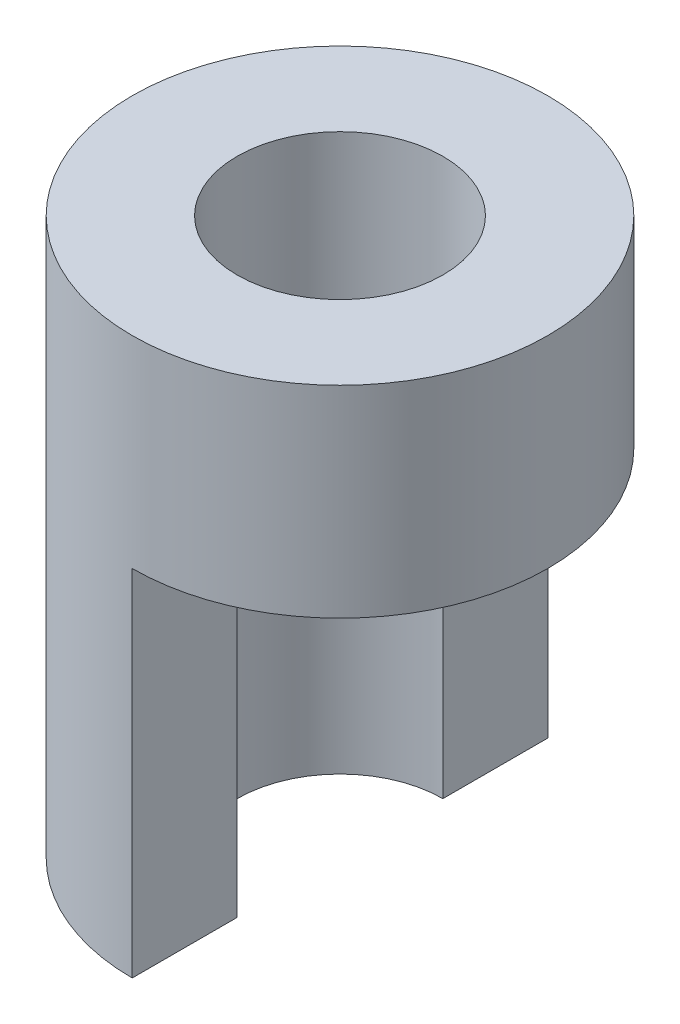
ISO-10303-21;
HEADER;
FILE_DESCRIPTION(('STEP AP214'),'2;1');
FILE_NAME('part.step','',(''),(''),'','','');
FILE_SCHEMA(('AUTOMOTIVE_DESIGN { 1 0 10303 214 1 1 1 1 }'));
ENDSEC;
DATA;
#1=APPLICATION_CONTEXT('core data for automotive mechanical design processes');
#2=APPLICATION_PROTOCOL_DEFINITION('international standard','automotive_design',2000,#1);
#3=PRODUCT_CONTEXT('',#1,'mechanical');
#4=PRODUCT('Part','Part','',(#3));
#5=PRODUCT_RELATED_PRODUCT_CATEGORY('part','',(#4));
#6=PRODUCT_DEFINITION_FORMATION('','',#4);
#7=PRODUCT_DEFINITION_CONTEXT('part definition',#1,'design');
#8=PRODUCT_DEFINITION('design','',#6,#7);
#9=PRODUCT_DEFINITION_SHAPE('','',#8);
#10=(LENGTH_UNIT() NAMED_UNIT(*) SI_UNIT(.MILLI.,.METRE.));
#11=(NAMED_UNIT(*) PLANE_ANGLE_UNIT() SI_UNIT($,.RADIAN.));
#12=(NAMED_UNIT(*) SI_UNIT($,.STERADIAN.) SOLID_ANGLE_UNIT());
#13=UNCERTAINTY_MEASURE_WITH_UNIT(LENGTH_MEASURE(1.E-05),#10,'distance_accuracy_value','');
#14=(GEOMETRIC_REPRESENTATION_CONTEXT(3) GLOBAL_UNCERTAINTY_ASSIGNED_CONTEXT((#13)) GLOBAL_UNIT_ASSIGNED_CONTEXT((#10,
#11,#12)) REPRESENTATION_CONTEXT('',''));
#15=CARTESIAN_POINT('',(0.,0.,0.));
#16=DIRECTION('',(0.,0.,1.));
#17=DIRECTION('',(1.,0.,0.));
#18=AXIS2_PLACEMENT_3D('',#15,#16,#17);
#19=CARTESIAN_POINT('',(0.,27.58,5.1));
#20=DIRECTION('',(1.,0.,0.));
#21=DIRECTION('',(0.,0.,-1.));
#22=AXIS2_PLACEMENT_3D('',#19,#20,#21);
#23=PLANE('',#22);
#24=DIRECTION('',(0.,-1.,0.));
#25=VECTOR('',#24,1.);
#26=CARTESIAN_POINT('',(0.,27.58,5.1));
#27=LINE('',#26,#25);
#28=CARTESIAN_POINT('',(0.,17.58,5.1));
#29=VERTEX_POINT('',#28);
#30=CARTESIAN_POINT('',(0.,0.,5.1));
#31=VERTEX_POINT('',#30);
#32=EDGE_CURVE('E40',#29,#31,#27,.T.);
#33=ORIENTED_EDGE('',*,*,#32,.F.);
#34=DIRECTION('',(0.,0.,-1.));
#35=VECTOR('',#34,1.);
#36=CARTESIAN_POINT('',(0.,17.58,10.3));
#37=LINE('',#36,#35);
#38=CARTESIAN_POINT('',(0.,17.58,10.3));
#39=VERTEX_POINT('',#38);
#40=EDGE_CURVE('E46',#39,#29,#37,.T.);
#41=ORIENTED_EDGE('',*,*,#40,.F.);
#42=DIRECTION('',(0.,-1.,0.));
#43=VECTOR('',#42,1.);
#44=CARTESIAN_POINT('',(0.,27.58,10.3));
#45=LINE('',#44,#43);
#46=CARTESIAN_POINT('',(0.,0.,10.3));
#47=VERTEX_POINT('',#46);
#48=EDGE_CURVE('E11',#39,#47,#45,.T.);
#49=ORIENTED_EDGE('',*,*,#48,.T.);
#50=DIRECTION('',(0.,0.,1.));
#51=VECTOR('',#50,1.);
#52=CARTESIAN_POINT('',(0.,0.,5.1));
#53=LINE('',#52,#51);
#54=EDGE_CURVE('E68',#31,#47,#53,.T.);
#55=ORIENTED_EDGE('',*,*,#54,.F.);
#56=EDGE_LOOP('',(#33,#41,#49,#55));
#57=FACE_BOUND('',#56,.T.);
#58=ADVANCED_FACE('F32',(#57),#23,.T.);
#59=CARTESIAN_POINT('',(0.,27.58,-10.3));
#60=DIRECTION('',(1.,0.,0.));
#61=DIRECTION('',(0.,0.,-1.));
#62=AXIS2_PLACEMENT_3D('',#59,#60,#61);
#63=PLANE('',#62);
#64=DIRECTION('',(0.,-1.,0.));
#65=VECTOR('',#64,1.);
#66=CARTESIAN_POINT('',(0.,27.58,-10.3));
#67=LINE('',#66,#65);
#68=CARTESIAN_POINT('',(0.,17.58,-10.3));
#69=VERTEX_POINT('',#68);
#70=CARTESIAN_POINT('',(0.,0.,-10.3));
#71=VERTEX_POINT('',#70);
#72=EDGE_CURVE('E76',#69,#71,#67,.T.);
#73=ORIENTED_EDGE('',*,*,#72,.F.);
#74=DIRECTION('',(0.,0.,-1.));
#75=VECTOR('',#74,1.);
#76=CARTESIAN_POINT('',(0.,17.58,-5.1));
#77=LINE('',#76,#75);
#78=CARTESIAN_POINT('',(0.,17.58,-5.1));
#79=VERTEX_POINT('',#78);
#80=EDGE_CURVE('E103',#79,#69,#77,.T.);
#81=ORIENTED_EDGE('',*,*,#80,.F.);
#82=DIRECTION('',(0.,-1.,0.));
#83=VECTOR('',#82,1.);
#84=CARTESIAN_POINT('',(0.,27.58,-5.1));
#85=LINE('',#84,#83);
#86=CARTESIAN_POINT('',(0.,0.,-5.1));
#87=VERTEX_POINT('',#86);
#88=EDGE_CURVE('E92',#79,#87,#85,.T.);
#89=ORIENTED_EDGE('',*,*,#88,.T.);
#90=DIRECTION('',(0.,0.,1.));
#91=VECTOR('',#90,1.);
#92=CARTESIAN_POINT('',(0.,0.,-10.3));
#93=LINE('',#92,#91);
#94=EDGE_CURVE('E85',#71,#87,#93,.T.);
#95=ORIENTED_EDGE('',*,*,#94,.F.);
#96=EDGE_LOOP('',(#73,#81,#89,#95));
#97=FACE_BOUND('',#96,.T.);
#98=ADVANCED_FACE('F127',(#97),#63,.T.);
#99=CARTESIAN_POINT('',(0.,27.58,0.));
#100=DIRECTION('',(0.,-1.,0.));
#101=DIRECTION('',(0.,0.,-1.));
#102=AXIS2_PLACEMENT_3D('',#99,#100,#101);
#103=CYLINDRICAL_SURFACE('',#102,10.3);
#104=ORIENTED_EDGE('',*,*,#48,.F.);
#105=CARTESIAN_POINT('',(0.,17.58,0.));
#106=DIRECTION('',(0.,1.,0.));
#107=DIRECTION('',(1.,0.,0.));
#108=AXIS2_PLACEMENT_3D('',#105,#106,#107);
#109=CIRCLE('',#108,10.3);
#110=EDGE_CURVE('E106',#39,#69,#109,.T.);
#111=ORIENTED_EDGE('',*,*,#110,.T.);
#112=ORIENTED_EDGE('',*,*,#72,.T.);
#113=CARTESIAN_POINT('',(0.,0.,0.));
#114=DIRECTION('',(0.,1.,0.));
#115=DIRECTION('',(1.,0.,0.));
#116=AXIS2_PLACEMENT_3D('',#113,#114,#115);
#117=CIRCLE('',#116,10.3);
#118=EDGE_CURVE('E74',#71,#47,#117,.T.);
#119=ORIENTED_EDGE('',*,*,#118,.T.);
#120=EDGE_LOOP('',(#104,#111,#112,#119));
#121=FACE_BOUND('',#120,.T.);
#122=CARTESIAN_POINT('',(0.,27.58,0.));
#123=DIRECTION('',(0.,1.,0.));
#124=DIRECTION('',(1.,0.,0.));
#125=AXIS2_PLACEMENT_3D('',#122,#123,#124);
#126=CIRCLE('',#125,10.3);
#127=CARTESIAN_POINT('',(10.3,27.58,0.));
#128=VERTEX_POINT('',#127);
#129=EDGE_CURVE('E90',#128,#128,#126,.T.);
#130=ORIENTED_EDGE('',*,*,#129,.F.);
#131=EDGE_LOOP('',(#130));
#132=FACE_BOUND('',#131,.T.);
#133=ADVANCED_FACE('F34',(#121,#132),#103,.T.);
#134=CARTESIAN_POINT('',(0.,27.58,0.));
#135=DIRECTION('',(0.,-1.,0.));
#136=DIRECTION('',(0.,0.,-1.));
#137=AXIS2_PLACEMENT_3D('',#134,#135,#136);
#138=CYLINDRICAL_SURFACE('',#137,5.1);
#139=CARTESIAN_POINT('',(0.,17.58,0.));
#140=DIRECTION('',(0.,1.,0.));
#141=DIRECTION('',(0.,0.,1.));
#142=AXIS2_PLACEMENT_3D('',#139,#140,#141);
#143=CIRCLE('',#142,5.1);
#144=EDGE_CURVE('E100',#29,#79,#143,.T.);
#145=ORIENTED_EDGE('',*,*,#144,.F.);
#146=ORIENTED_EDGE('',*,*,#32,.T.);
#147=CARTESIAN_POINT('',(0.,0.,0.));
#148=DIRECTION('',(0.,1.,0.));
#149=DIRECTION('',(0.,0.,1.));
#150=AXIS2_PLACEMENT_3D('',#147,#148,#149);
#151=CIRCLE('',#150,5.1);
#152=EDGE_CURVE('E83',#87,#31,#151,.T.);
#153=ORIENTED_EDGE('',*,*,#152,.F.);
#154=ORIENTED_EDGE('',*,*,#88,.F.);
#155=EDGE_LOOP('',(#145,#146,#153,#154));
#156=FACE_BOUND('',#155,.T.);
#157=CARTESIAN_POINT('',(0.,27.58,0.));
#158=DIRECTION('',(0.,1.,0.));
#159=DIRECTION('',(0.,0.,1.));
#160=AXIS2_PLACEMENT_3D('',#157,#158,#159);
#161=CIRCLE('',#160,5.1);
#162=CARTESIAN_POINT('',(0.,27.58,5.1));
#163=VERTEX_POINT('',#162);
#164=EDGE_CURVE('E93',#163,#163,#161,.T.);
#165=ORIENTED_EDGE('',*,*,#164,.T.);
#166=EDGE_LOOP('',(#165));
#167=FACE_BOUND('',#166,.T.);
#168=ADVANCED_FACE('F96',(#156,#167),#138,.F.);
#169=CARTESIAN_POINT('',(0.,27.58,0.));
#170=DIRECTION('',(0.,1.,0.));
#171=DIRECTION('',(1.,0.,0.));
#172=AXIS2_PLACEMENT_3D('',#169,#170,#171);
#173=PLANE('',#172);
#174=ORIENTED_EDGE('',*,*,#129,.T.);
#175=EDGE_LOOP('',(#174));
#176=FACE_BOUND('',#175,.T.);
#177=ORIENTED_EDGE('',*,*,#164,.F.);
#178=EDGE_LOOP('',(#177));
#179=FACE_BOUND('',#178,.T.);
#180=ADVANCED_FACE('F114',(#176,#179),#173,.T.);
#181=CARTESIAN_POINT('',(0.,0.,0.));
#182=DIRECTION('',(0.,1.,0.));
#183=DIRECTION('',(1.,0.,0.));
#184=AXIS2_PLACEMENT_3D('',#181,#182,#183);
#185=PLANE('',#184);
#186=ORIENTED_EDGE('',*,*,#118,.F.);
#187=ORIENTED_EDGE('',*,*,#94,.T.);
#188=ORIENTED_EDGE('',*,*,#152,.T.);
#189=ORIENTED_EDGE('',*,*,#54,.T.);
#190=EDGE_LOOP('',(#186,#187,#188,#189));
#191=FACE_BOUND('',#190,.T.);
#192=ADVANCED_FACE('F81',(#191),#185,.F.);
#193=CARTESIAN_POINT('',(0.,17.58,0.));
#194=DIRECTION('',(0.,1.,0.));
#195=DIRECTION('',(1.,0.,0.));
#196=AXIS2_PLACEMENT_3D('',#193,#194,#195);
#197=PLANE('',#196);
#198=ORIENTED_EDGE('',*,*,#110,.F.);
#199=ORIENTED_EDGE('',*,*,#40,.T.);
#200=ORIENTED_EDGE('',*,*,#144,.T.);
#201=ORIENTED_EDGE('',*,*,#80,.T.);
#202=EDGE_LOOP('',(#198,#199,#200,#201));
#203=FACE_BOUND('',#202,.T.);
#204=ADVANCED_FACE('F122',(#203),#197,.F.);
#205=CLOSED_SHELL('',(#58,#98,#133,#168,#180,#192,#204));
#206=MANIFOLD_SOLID_BREP('B2',#205);
#207=ADVANCED_BREP_SHAPE_REPRESENTATION('',(#18,#206),#14);
#208=SHAPE_DEFINITION_REPRESENTATION(#9,#207);
ENDSEC;
END-ISO-10303-21;
